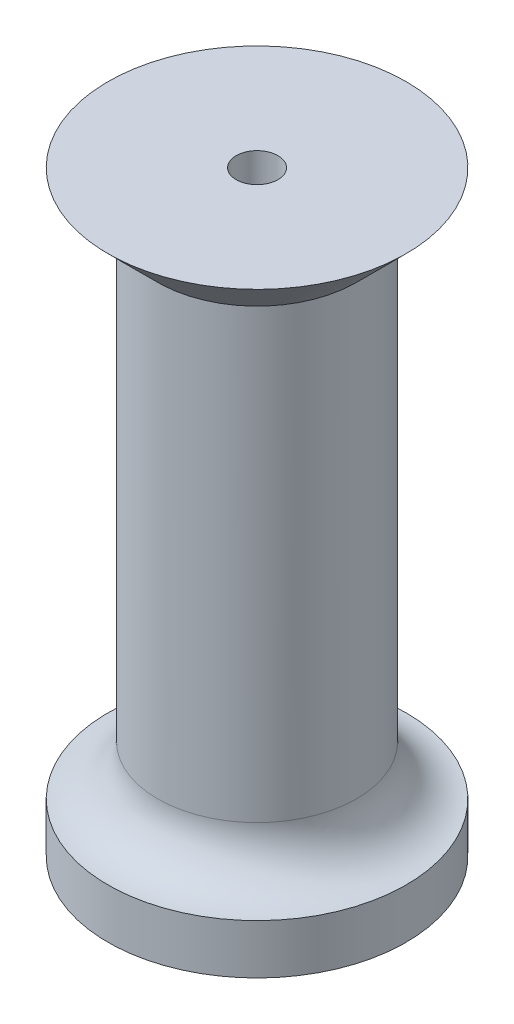
ISO-10303-21;
HEADER;
FILE_DESCRIPTION(('STEP AP214'),'2;1');
FILE_NAME('part.step','',(''),(''),'','','');
FILE_SCHEMA(('AUTOMOTIVE_DESIGN { 1 0 10303 214 1 1 1 1 }'));
ENDSEC;
DATA;
#1=APPLICATION_CONTEXT('core data for automotive mechanical design processes');
#2=APPLICATION_PROTOCOL_DEFINITION('international standard','automotive_design',2000,#1);
#3=PRODUCT_CONTEXT('',#1,'mechanical');
#4=PRODUCT('Part','Part','',(#3));
#5=PRODUCT_RELATED_PRODUCT_CATEGORY('part','',(#4));
#6=PRODUCT_DEFINITION_FORMATION('','',#4);
#7=PRODUCT_DEFINITION_CONTEXT('part definition',#1,'design');
#8=PRODUCT_DEFINITION('design','',#6,#7);
#9=PRODUCT_DEFINITION_SHAPE('','',#8);
#10=(LENGTH_UNIT() NAMED_UNIT(*) SI_UNIT(.MILLI.,.METRE.));
#11=(NAMED_UNIT(*) PLANE_ANGLE_UNIT() SI_UNIT($,.RADIAN.));
#12=(NAMED_UNIT(*) SI_UNIT($,.STERADIAN.) SOLID_ANGLE_UNIT());
#13=UNCERTAINTY_MEASURE_WITH_UNIT(LENGTH_MEASURE(1.E-05),#10,'distance_accuracy_value','');
#14=(GEOMETRIC_REPRESENTATION_CONTEXT(3) GLOBAL_UNCERTAINTY_ASSIGNED_CONTEXT((#13)) GLOBAL_UNIT_ASSIGNED_CONTEXT((#10,
#11,#12)) REPRESENTATION_CONTEXT('',''));
#15=CARTESIAN_POINT('',(0.,0.,0.));
#16=DIRECTION('',(0.,0.,1.));
#17=DIRECTION('',(1.,0.,0.));
#18=AXIS2_PLACEMENT_3D('',#15,#16,#17);
#19=CARTESIAN_POINT('',(3.55,53.6,-2.04959345562317));
#20=DIRECTION('',(0.5,0.,-0.866025403784439));
#21=DIRECTION('',(-0.866025403784439,0.,-0.5));
#22=AXIS2_PLACEMENT_3D('',#19,#20,#21);
#23=PLANE('',#22);
#24=DIRECTION('',(-0.866025403784439,0.,-0.5));
#25=VECTOR('',#24,1.);
#26=CARTESIAN_POINT('',(3.55,57.,-2.04959345562317));
#27=LINE('',#26,#25);
#28=CARTESIAN_POINT('',(3.55,57.,-2.04959345562317));
#29=VERTEX_POINT('',#28);
#30=CARTESIAN_POINT('',(0.,57.,-4.09918691124634));
#31=VERTEX_POINT('',#30);
#32=EDGE_CURVE('E128',#29,#31,#27,.T.);
#33=ORIENTED_EDGE('',*,*,#32,.T.);
#34=DIRECTION('',(0.,1.,0.));
#35=VECTOR('',#34,1.);
#36=CARTESIAN_POINT('',(0.,53.6,-4.09918691124634));
#37=LINE('',#36,#35);
#38=CARTESIAN_POINT('',(0.,53.6,-4.09918691124634));
#39=VERTEX_POINT('',#38);
#40=EDGE_CURVE('E87',#39,#31,#37,.T.);
#41=ORIENTED_EDGE('',*,*,#40,.F.);
#42=DIRECTION('',(-0.866025403784439,0.,-0.5));
#43=VECTOR('',#42,1.);
#44=CARTESIAN_POINT('',(3.55,53.6,-2.04959345562317));
#45=LINE('',#44,#43);
#46=CARTESIAN_POINT('',(3.55,53.6,-2.04959345562317));
#47=VERTEX_POINT('',#46);
#48=EDGE_CURVE('E142',#47,#39,#45,.T.);
#49=ORIENTED_EDGE('',*,*,#48,.F.);
#50=DIRECTION('',(0.,1.,0.));
#51=VECTOR('',#50,1.);
#52=CARTESIAN_POINT('',(3.55,53.6,-2.04959345562317));
#53=LINE('',#52,#51);
#54=EDGE_CURVE('E58',#47,#29,#53,.T.);
#55=ORIENTED_EDGE('',*,*,#54,.T.);
#56=EDGE_LOOP('',(#33,#41,#49,#55));
#57=FACE_BOUND('',#56,.T.);
#58=ADVANCED_FACE('F39',(#57),#23,.F.);
#59=CARTESIAN_POINT('',(3.55,53.6,2.04959345562317));
#60=DIRECTION('',(1.,0.,0.));
#61=DIRECTION('',(0.,0.,-1.));
#62=AXIS2_PLACEMENT_3D('',#59,#60,#61);
#63=PLANE('',#62);
#64=DIRECTION('',(0.,0.,-1.));
#65=VECTOR('',#64,1.);
#66=CARTESIAN_POINT('',(3.55,57.,2.04959345562317));
#67=LINE('',#66,#65);
#68=CARTESIAN_POINT('',(3.55,57.,2.04959345562317));
#69=VERTEX_POINT('',#68);
#70=EDGE_CURVE('E140',#69,#29,#67,.T.);
#71=ORIENTED_EDGE('',*,*,#70,.T.);
#72=ORIENTED_EDGE('',*,*,#54,.F.);
#73=DIRECTION('',(0.,0.,-1.));
#74=VECTOR('',#73,1.);
#75=CARTESIAN_POINT('',(3.55,53.6,2.04959345562317));
#76=LINE('',#75,#74);
#77=CARTESIAN_POINT('',(3.55,53.6,2.04959345562317));
#78=VERTEX_POINT('',#77);
#79=EDGE_CURVE('E115',#78,#47,#76,.T.);
#80=ORIENTED_EDGE('',*,*,#79,.F.);
#81=DIRECTION('',(0.,1.,0.));
#82=VECTOR('',#81,1.);
#83=CARTESIAN_POINT('',(3.55,53.6,2.04959345562317));
#84=LINE('',#83,#82);
#85=EDGE_CURVE('E78',#78,#69,#84,.T.);
#86=ORIENTED_EDGE('',*,*,#85,.T.);
#87=EDGE_LOOP('',(#71,#72,#80,#86));
#88=FACE_BOUND('',#87,.T.);
#89=ADVANCED_FACE('F178',(#88),#63,.F.);
#90=CARTESIAN_POINT('',(0.,53.6,4.09918691124634));
#91=DIRECTION('',(0.5,0.,0.866025403784439));
#92=DIRECTION('',(0.866025403784439,0.,-0.5));
#93=AXIS2_PLACEMENT_3D('',#90,#91,#92);
#94=PLANE('',#93);
#95=DIRECTION('',(0.866025403784439,0.,-0.5));
#96=VECTOR('',#95,1.);
#97=CARTESIAN_POINT('',(0.,57.,4.09918691124634));
#98=LINE('',#97,#96);
#99=CARTESIAN_POINT('',(0.,57.,4.09918691124634));
#100=VERTEX_POINT('',#99);
#101=EDGE_CURVE('E138',#100,#69,#98,.T.);
#102=ORIENTED_EDGE('',*,*,#101,.T.);
#103=ORIENTED_EDGE('',*,*,#85,.F.);
#104=DIRECTION('',(0.866025403784439,0.,-0.5));
#105=VECTOR('',#104,1.);
#106=CARTESIAN_POINT('',(0.,53.6,4.09918691124634));
#107=LINE('',#106,#105);
#108=CARTESIAN_POINT('',(0.,53.6,4.09918691124634));
#109=VERTEX_POINT('',#108);
#110=EDGE_CURVE('E111',#109,#78,#107,.T.);
#111=ORIENTED_EDGE('',*,*,#110,.F.);
#112=DIRECTION('',(0.,1.,0.));
#113=VECTOR('',#112,1.);
#114=CARTESIAN_POINT('',(0.,53.6,4.09918691124634));
#115=LINE('',#114,#113);
#116=EDGE_CURVE('E98',#109,#100,#115,.T.);
#117=ORIENTED_EDGE('',*,*,#116,.T.);
#118=EDGE_LOOP('',(#102,#103,#111,#117));
#119=FACE_BOUND('',#118,.T.);
#120=ADVANCED_FACE('F112',(#119),#94,.F.);
#121=CARTESIAN_POINT('',(-3.55,53.6,2.04959345562317));
#122=DIRECTION('',(-0.5,0.,0.866025403784439));
#123=DIRECTION('',(0.866025403784439,0.,0.5));
#124=AXIS2_PLACEMENT_3D('',#121,#122,#123);
#125=PLANE('',#124);
#126=DIRECTION('',(0.866025403784439,0.,0.5));
#127=VECTOR('',#126,1.);
#128=CARTESIAN_POINT('',(-3.55,57.,2.04959345562317));
#129=LINE('',#128,#127);
#130=CARTESIAN_POINT('',(-3.55,57.,2.04959345562317));
#131=VERTEX_POINT('',#130);
#132=EDGE_CURVE('E105',#131,#100,#129,.T.);
#133=ORIENTED_EDGE('',*,*,#132,.T.);
#134=ORIENTED_EDGE('',*,*,#116,.F.);
#135=DIRECTION('',(0.866025403784439,0.,0.5));
#136=VECTOR('',#135,1.);
#137=CARTESIAN_POINT('',(-3.55,53.6,2.04959345562317));
#138=LINE('',#137,#136);
#139=CARTESIAN_POINT('',(-3.55,53.6,2.04959345562317));
#140=VERTEX_POINT('',#139);
#141=EDGE_CURVE('E102',#140,#109,#138,.T.);
#142=ORIENTED_EDGE('',*,*,#141,.F.);
#143=DIRECTION('',(0.,1.,0.));
#144=VECTOR('',#143,1.);
#145=CARTESIAN_POINT('',(-3.55,53.6,2.04959345562317));
#146=LINE('',#145,#144);
#147=EDGE_CURVE('E108',#140,#131,#146,.T.);
#148=ORIENTED_EDGE('',*,*,#147,.T.);
#149=EDGE_LOOP('',(#133,#134,#142,#148));
#150=FACE_BOUND('',#149,.T.);
#151=ADVANCED_FACE('F100',(#150),#125,.F.);
#152=CARTESIAN_POINT('',(-3.55,53.6,-2.04959345562317));
#153=DIRECTION('',(-1.,0.,0.));
#154=DIRECTION('',(0.,0.,1.));
#155=AXIS2_PLACEMENT_3D('',#152,#153,#154);
#156=PLANE('',#155);
#157=DIRECTION('',(0.,0.,1.));
#158=VECTOR('',#157,1.);
#159=CARTESIAN_POINT('',(-3.55,57.,-2.04959345562317));
#160=LINE('',#159,#158);
#161=CARTESIAN_POINT('',(-3.55,57.,-2.04959345562317));
#162=VERTEX_POINT('',#161);
#163=EDGE_CURVE('E134',#162,#131,#160,.T.);
#164=ORIENTED_EDGE('',*,*,#163,.T.);
#165=ORIENTED_EDGE('',*,*,#147,.F.);
#166=DIRECTION('',(0.,0.,1.));
#167=VECTOR('',#166,1.);
#168=CARTESIAN_POINT('',(-3.55,53.6,-2.04959345562317));
#169=LINE('',#168,#167);
#170=CARTESIAN_POINT('',(-3.55,53.6,-2.04959345562317));
#171=VERTEX_POINT('',#170);
#172=EDGE_CURVE('E121',#171,#140,#169,.T.);
#173=ORIENTED_EDGE('',*,*,#172,.F.);
#174=DIRECTION('',(0.,1.,0.));
#175=VECTOR('',#174,1.);
#176=CARTESIAN_POINT('',(-3.55,53.6,-2.04959345562317));
#177=LINE('',#176,#175);
#178=EDGE_CURVE('E147',#171,#162,#177,.T.);
#179=ORIENTED_EDGE('',*,*,#178,.T.);
#180=EDGE_LOOP('',(#164,#165,#173,#179));
#181=FACE_BOUND('',#180,.T.);
#182=ADVANCED_FACE('F188',(#181),#156,.F.);
#183=CARTESIAN_POINT('',(0.,53.6,-4.09918691124634));
#184=DIRECTION('',(-0.5,0.,-0.866025403784439));
#185=DIRECTION('',(-0.866025403784439,0.,0.5));
#186=AXIS2_PLACEMENT_3D('',#183,#184,#185);
#187=PLANE('',#186);
#188=DIRECTION('',(-0.866025403784439,0.,0.5));
#189=VECTOR('',#188,1.);
#190=CARTESIAN_POINT('',(0.,57.,-4.09918691124634));
#191=LINE('',#190,#189);
#192=EDGE_CURVE('E130',#31,#162,#191,.T.);
#193=ORIENTED_EDGE('',*,*,#192,.T.);
#194=ORIENTED_EDGE('',*,*,#178,.F.);
#195=DIRECTION('',(-0.866025403784439,0.,0.5));
#196=VECTOR('',#195,1.);
#197=CARTESIAN_POINT('',(0.,53.6,-4.09918691124634));
#198=LINE('',#197,#196);
#199=EDGE_CURVE('E123',#39,#171,#198,.T.);
#200=ORIENTED_EDGE('',*,*,#199,.F.);
#201=ORIENTED_EDGE('',*,*,#40,.T.);
#202=EDGE_LOOP('',(#193,#194,#200,#201));
#203=FACE_BOUND('',#202,.T.);
#204=ADVANCED_FACE('F185',(#203),#187,.F.);
#205=CARTESIAN_POINT('',(0.,53.6,0.));
#206=DIRECTION('',(0.,1.,0.));
#207=DIRECTION('',(0.,0.,1.));
#208=AXIS2_PLACEMENT_3D('',#205,#206,#207);
#209=PLANE('',#208);
#210=CARTESIAN_POINT('',(0.,53.6,0.));
#211=DIRECTION('',(0.,1.,0.));
#212=DIRECTION('',(0.,0.,1.));
#213=AXIS2_PLACEMENT_3D('',#210,#211,#212);
#214=CIRCLE('',#213,2.1);
#215=CARTESIAN_POINT('',(0.,53.6,2.1));
#216=VERTEX_POINT('',#215);
#217=EDGE_CURVE('E131',#216,#216,#214,.T.);
#218=ORIENTED_EDGE('',*,*,#217,.F.);
#219=EDGE_LOOP('',(#218));
#220=FACE_BOUND('',#219,.T.);
#221=ORIENTED_EDGE('',*,*,#48,.T.);
#222=ORIENTED_EDGE('',*,*,#199,.T.);
#223=ORIENTED_EDGE('',*,*,#172,.T.);
#224=ORIENTED_EDGE('',*,*,#141,.T.);
#225=ORIENTED_EDGE('',*,*,#110,.T.);
#226=ORIENTED_EDGE('',*,*,#79,.T.);
#227=EDGE_LOOP('',(#221,#222,#223,#224,#225,#226));
#228=FACE_BOUND('',#227,.T.);
#229=ADVANCED_FACE('F118',(#220,#228),#209,.T.);
#230=CARTESIAN_POINT('',(0.,57.,0.));
#231=DIRECTION('',(0.,1.,0.));
#232=DIRECTION('',(0.,0.,1.));
#233=AXIS2_PLACEMENT_3D('',#230,#231,#232);
#234=PLANE('',#233);
#235=CARTESIAN_POINT('',(0.,57.,0.));
#236=DIRECTION('',(0.,1.,0.));
#237=DIRECTION('',(0.,0.,1.));
#238=AXIS2_PLACEMENT_3D('',#235,#236,#237);
#239=CIRCLE('',#238,2.1);
#240=CARTESIAN_POINT('',(0.,57.,2.1));
#241=VERTEX_POINT('',#240);
#242=EDGE_CURVE('E44',#241,#241,#239,.T.);
#243=ORIENTED_EDGE('',*,*,#242,.T.);
#244=EDGE_LOOP('',(#243));
#245=FACE_BOUND('',#244,.T.);
#246=ORIENTED_EDGE('',*,*,#32,.F.);
#247=ORIENTED_EDGE('',*,*,#70,.F.);
#248=ORIENTED_EDGE('',*,*,#101,.F.);
#249=ORIENTED_EDGE('',*,*,#132,.F.);
#250=ORIENTED_EDGE('',*,*,#163,.F.);
#251=ORIENTED_EDGE('',*,*,#192,.F.);
#252=EDGE_LOOP('',(#246,#247,#248,#249,#250,#251));
#253=FACE_BOUND('',#252,.T.);
#254=ADVANCED_FACE('F197',(#245,#253),#234,.F.);
#255=CARTESIAN_POINT('',(0.,48.,0.));
#256=DIRECTION('',(0.,1.,0.));
#257=DIRECTION('',(0.,0.,1.));
#258=AXIS2_PLACEMENT_3D('',#255,#256,#257);
#259=CYLINDRICAL_SURFACE('',#258,2.1);
#260=CARTESIAN_POINT('',(0.,60.,0.));
#261=DIRECTION('',(0.,1.,0.));
#262=DIRECTION('',(0.,0.,1.));
#263=AXIS2_PLACEMENT_3D('',#260,#261,#262);
#264=CIRCLE('',#263,2.1);
#265=CARTESIAN_POINT('',(0.,60.,2.1));
#266=VERTEX_POINT('',#265);
#267=EDGE_CURVE('E221',#266,#266,#264,.T.);
#268=ORIENTED_EDGE('',*,*,#267,.T.);
#269=EDGE_LOOP('',(#268));
#270=FACE_BOUND('',#269,.T.);
#271=ORIENTED_EDGE('',*,*,#242,.F.);
#272=EDGE_LOOP('',(#271));
#273=FACE_BOUND('',#272,.T.);
#274=ADVANCED_FACE('F200',(#270,#273),#259,.F.);
#275=ORIENTED_EDGE('',*,*,#217,.T.);
#276=EDGE_LOOP('',(#275));
#277=FACE_BOUND('',#276,.T.);
#278=CARTESIAN_POINT('',(0.,48.,0.));
#279=DIRECTION('',(0.,1.,0.));
#280=DIRECTION('',(0.,0.,1.));
#281=AXIS2_PLACEMENT_3D('',#278,#279,#280);
#282=CIRCLE('',#281,2.1);
#283=CARTESIAN_POINT('',(0.,48.,2.1));
#284=VERTEX_POINT('',#283);
#285=EDGE_CURVE('E219',#284,#284,#282,.T.);
#286=ORIENTED_EDGE('',*,*,#285,.F.);
#287=EDGE_LOOP('',(#286));
#288=FACE_BOUND('',#287,.T.);
#289=ADVANCED_FACE('F205',(#277,#288),#259,.F.);
#290=CARTESIAN_POINT('',(0.,48.,0.));
#291=DIRECTION('',(0.,1.,0.));
#292=DIRECTION('',(0.,0.,1.));
#293=AXIS2_PLACEMENT_3D('',#290,#291,#292);
#294=PLANE('',#293);
#295=ORIENTED_EDGE('',*,*,#285,.T.);
#296=EDGE_LOOP('',(#295));
#297=FACE_BOUND('',#296,.T.);
#298=ADVANCED_FACE('F208',(#297),#294,.T.);
#299=CARTESIAN_POINT('',(-15.,60.,0.));
#300=DIRECTION('',(0.,1.,0.));
#301=DIRECTION('',(0.,0.,1.));
#302=AXIS2_PLACEMENT_3D('',#299,#300,#301);
#303=PLANE('',#302);
#304=ORIENTED_EDGE('',*,*,#267,.F.);
#305=EDGE_LOOP('',(#304));
#306=FACE_BOUND('',#305,.T.);
#307=CARTESIAN_POINT('',(0.,60.,0.));
#308=DIRECTION('',(0.,-1.,0.));
#309=DIRECTION('',(0.,0.,-1.));
#310=AXIS2_PLACEMENT_3D('',#307,#308,#309);
#311=CIRCLE('',#310,15.);
#312=CARTESIAN_POINT('',(0.,60.,-15.));
#313=VERTEX_POINT('',#312);
#314=EDGE_CURVE('E144',#313,#313,#311,.T.);
#315=ORIENTED_EDGE('',*,*,#314,.F.);
#316=EDGE_LOOP('',(#315));
#317=FACE_BOUND('',#316,.T.);
#318=ADVANCED_FACE('F175',(#306,#317),#303,.T.);
#319=CARTESIAN_POINT('',(-15.,0.,0.));
#320=DIRECTION('',(0.,-1.,0.));
#321=DIRECTION('',(0.,0.,-1.));
#322=AXIS2_PLACEMENT_3D('',#319,#320,#321);
#323=PLANE('',#322);
#324=CARTESIAN_POINT('',(0.,0.,0.));
#325=DIRECTION('',(0.,-1.,0.));
#326=DIRECTION('',(0.,0.,-1.));
#327=AXIS2_PLACEMENT_3D('',#324,#325,#326);
#328=CIRCLE('',#327,15.);
#329=CARTESIAN_POINT('',(0.,0.,-15.));
#330=VERTEX_POINT('',#329);
#331=EDGE_CURVE('E50',#330,#330,#328,.T.);
#332=ORIENTED_EDGE('',*,*,#331,.T.);
#333=EDGE_LOOP('',(#332));
#334=FACE_BOUND('',#333,.T.);
#335=ADVANCED_FACE('F161',(#334),#323,.T.);
#336=CARTESIAN_POINT('',(0.,-25.,0.));
#337=DIRECTION('',(0.,-1.,0.));
#338=DIRECTION('',(0.,0.,-1.));
#339=AXIS2_PLACEMENT_3D('',#336,#337,#338);
#340=CYLINDRICAL_SURFACE('',#339,15.);
#341=CARTESIAN_POINT('',(0.,5.,0.));
#342=DIRECTION('',(0.,-1.,0.));
#343=DIRECTION('',(0.,0.,-1.));
#344=AXIS2_PLACEMENT_3D('',#341,#342,#343);
#345=CIRCLE('',#344,15.);
#346=CARTESIAN_POINT('',(0.,5.,-15.));
#347=VERTEX_POINT('',#346);
#348=EDGE_CURVE('E155',#347,#347,#345,.T.);
#349=ORIENTED_EDGE('',*,*,#348,.T.);
#350=EDGE_LOOP('',(#349));
#351=FACE_BOUND('',#350,.T.);
#352=ORIENTED_EDGE('',*,*,#331,.F.);
#353=EDGE_LOOP('',(#352));
#354=FACE_BOUND('',#353,.T.);
#355=ADVANCED_FACE('F163',(#351,#354),#340,.T.);
#356=CARTESIAN_POINT('',(0.,-25.,0.));
#357=DIRECTION('',(0.,-1.,0.));
#358=DIRECTION('',(0.,0.,-1.));
#359=AXIS2_PLACEMENT_3D('',#356,#357,#358);
#360=CYLINDRICAL_SURFACE('',#359,10.);
#361=CARTESIAN_POINT('',(0.,10.,0.));
#362=DIRECTION('',(0.,1.,0.));
#363=DIRECTION('',(0.,0.,1.));
#364=AXIS2_PLACEMENT_3D('',#361,#362,#363);
#365=CIRCLE('',#364,10.);
#366=CARTESIAN_POINT('',(0.,10.,10.));
#367=VERTEX_POINT('',#366);
#368=EDGE_CURVE('E11',#367,#367,#365,.T.);
#369=ORIENTED_EDGE('',*,*,#368,.T.);
#370=EDGE_LOOP('',(#369));
#371=FACE_BOUND('',#370,.T.);
#372=CARTESIAN_POINT('',(0.,55.,0.));
#373=DIRECTION('',(0.,-1.,0.));
#374=DIRECTION('',(0.,0.,-1.));
#375=AXIS2_PLACEMENT_3D('',#372,#373,#374);
#376=CIRCLE('',#375,10.);
#377=CARTESIAN_POINT('',(0.,55.,-10.));
#378=VERTEX_POINT('',#377);
#379=EDGE_CURVE('E152',#378,#378,#376,.T.);
#380=ORIENTED_EDGE('',*,*,#379,.T.);
#381=EDGE_LOOP('',(#380));
#382=FACE_BOUND('',#381,.T.);
#383=ADVANCED_FACE('F165',(#371,#382),#360,.T.);
#384=CARTESIAN_POINT('',(0.,10.,0.));
#385=DIRECTION('',(0.,1.,0.));
#386=DIRECTION('',(0.,0.,1.));
#387=AXIS2_PLACEMENT_3D('',#384,#385,#386);
#388=TOROIDAL_SURFACE('',#387,15.,5.);
#389=ORIENTED_EDGE('',*,*,#368,.F.);
#390=EDGE_LOOP('',(#389));
#391=FACE_BOUND('',#390,.T.);
#392=ORIENTED_EDGE('',*,*,#348,.F.);
#393=EDGE_LOOP('',(#392));
#394=FACE_BOUND('',#393,.T.);
#395=ADVANCED_FACE('F172',(#391,#394),#388,.F.);
#396=CARTESIAN_POINT('',(0.,55.,0.));
#397=DIRECTION('',(0.,1.,0.));
#398=DIRECTION('',(0.,0.,1.));
#399=AXIS2_PLACEMENT_3D('',#396,#397,#398);
#400=CONICAL_SURFACE('',#399,9.99999999999999,0.785398163397448);
#401=ORIENTED_EDGE('',*,*,#314,.T.);
#402=EDGE_LOOP('',(#401));
#403=FACE_BOUND('',#402,.T.);
#404=ORIENTED_EDGE('',*,*,#379,.F.);
#405=EDGE_LOOP('',(#404));
#406=FACE_BOUND('',#405,.T.);
#407=ADVANCED_FACE('F42',(#403,#406),#400,.T.);
#408=CLOSED_SHELL('',(#58,#89,#120,#151,#182,#204,#229,#254,#274,#289,#298,#318,#335,#355,#383,
#395,#407));
#409=MANIFOLD_SOLID_BREP('B2',#408);
#410=ADVANCED_BREP_SHAPE_REPRESENTATION('',(#18,#409),#14);
#411=SHAPE_DEFINITION_REPRESENTATION(#9,#410);
ENDSEC;
END-ISO-10303-21;
